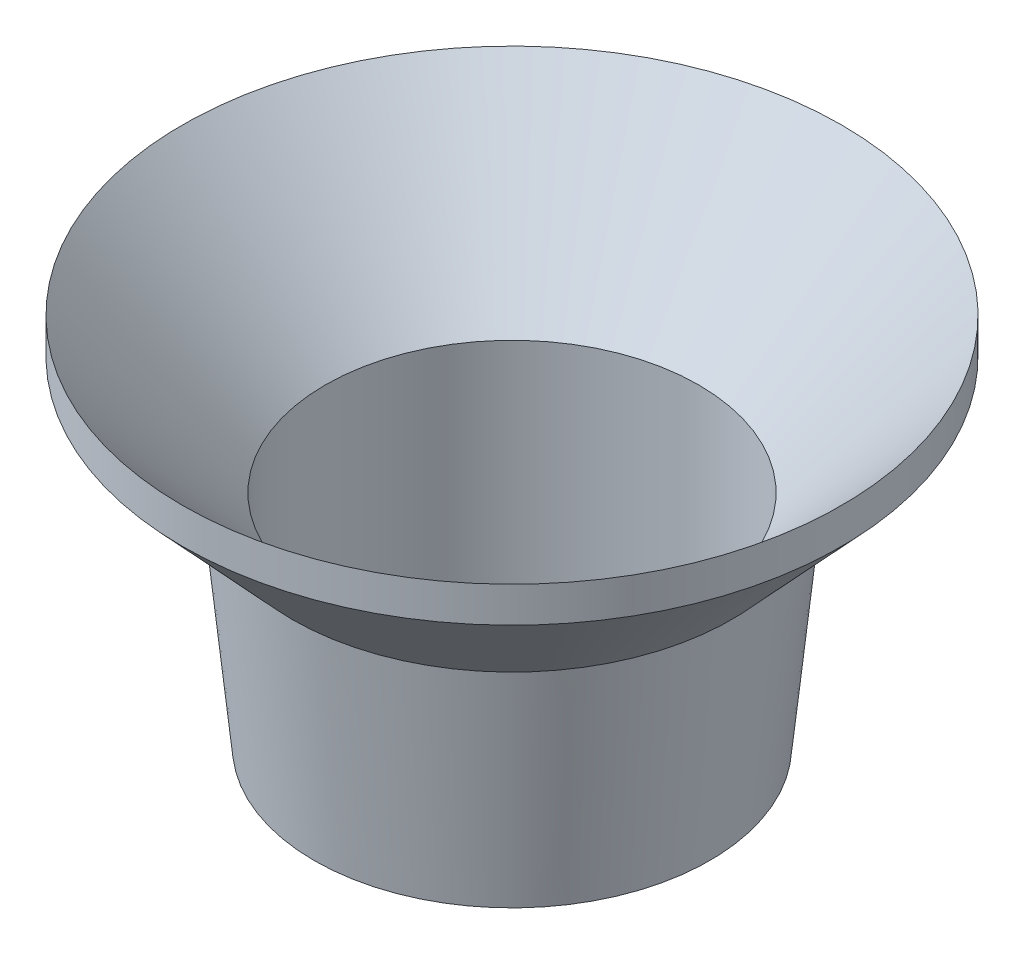
ISO-10303-21;
HEADER;
FILE_DESCRIPTION(('STEP AP214'),'2;1');
FILE_NAME('part.step','',(''),(''),'','','');
FILE_SCHEMA(('AUTOMOTIVE_DESIGN { 1 0 10303 214 1 1 1 1 }'));
ENDSEC;
DATA;
#1=APPLICATION_CONTEXT('core data for automotive mechanical design processes');
#2=APPLICATION_PROTOCOL_DEFINITION('international standard','automotive_design',2000,#1);
#3=PRODUCT_CONTEXT('',#1,'mechanical');
#4=PRODUCT('Part','Part','',(#3));
#5=PRODUCT_RELATED_PRODUCT_CATEGORY('part','',(#4));
#6=PRODUCT_DEFINITION_FORMATION('','',#4);
#7=PRODUCT_DEFINITION_CONTEXT('part definition',#1,'design');
#8=PRODUCT_DEFINITION('design','',#6,#7);
#9=PRODUCT_DEFINITION_SHAPE('','',#8);
#10=(LENGTH_UNIT() NAMED_UNIT(*) SI_UNIT(.MILLI.,.METRE.));
#11=(NAMED_UNIT(*) PLANE_ANGLE_UNIT() SI_UNIT($,.RADIAN.));
#12=(NAMED_UNIT(*) SI_UNIT($,.STERADIAN.) SOLID_ANGLE_UNIT());
#13=UNCERTAINTY_MEASURE_WITH_UNIT(LENGTH_MEASURE(1.E-05),#10,'distance_accuracy_value','');
#14=(GEOMETRIC_REPRESENTATION_CONTEXT(3) GLOBAL_UNCERTAINTY_ASSIGNED_CONTEXT((#13)) GLOBAL_UNIT_ASSIGNED_CONTEXT((#10,
#11,#12)) REPRESENTATION_CONTEXT('',''));
#15=CARTESIAN_POINT('',(0.,0.,0.));
#16=DIRECTION('',(0.,0.,1.));
#17=DIRECTION('',(1.,0.,0.));
#18=AXIS2_PLACEMENT_3D('',#15,#16,#17);
#19=CARTESIAN_POINT('',(0.,20.7758620689655,0.));
#20=DIRECTION('',(0.,1.,0.));
#21=DIRECTION('',(0.,0.,1.));
#22=AXIS2_PLACEMENT_3D('',#19,#20,#21);
#23=CYLINDRICAL_SURFACE('',#22,15.);
#24=CARTESIAN_POINT('',(0.,10.3846153846154,0.));
#25=DIRECTION('',(0.,1.,0.));
#26=DIRECTION('',(0.,0.,1.));
#27=AXIS2_PLACEMENT_3D('',#24,#25,#26);
#28=CIRCLE('',#27,15.);
#29=CARTESIAN_POINT('',(0.,10.3846153846154,15.));
#30=VERTEX_POINT('',#29);
#31=EDGE_CURVE('E53',#30,#30,#28,.T.);
#32=ORIENTED_EDGE('',*,*,#31,.T.);
#33=EDGE_LOOP('',(#32));
#34=FACE_BOUND('',#33,.T.);
#35=CARTESIAN_POINT('',(0.,12.,0.));
#36=DIRECTION('',(0.,1.,0.));
#37=DIRECTION('',(0.,0.,1.));
#38=AXIS2_PLACEMENT_3D('',#35,#36,#37);
#39=CIRCLE('',#38,15.);
#40=CARTESIAN_POINT('',(0.,12.,15.));
#41=VERTEX_POINT('',#40);
#42=EDGE_CURVE('E10',#41,#41,#39,.T.);
#43=ORIENTED_EDGE('',*,*,#42,.F.);
#44=EDGE_LOOP('',(#43));
#45=FACE_BOUND('',#44,.T.);
#46=ADVANCED_FACE('F31',(#34,#45),#23,.T.);
#47=CARTESIAN_POINT('',(0.,4.99999999999999,0.));
#48=DIRECTION('',(0.,1.,0.));
#49=DIRECTION('',(0.,0.,1.));
#50=AXIS2_PLACEMENT_3D('',#47,#48,#49);
#51=CONICAL_SURFACE('',#50,8.50000000000001,0.748378047523518);
#52=ORIENTED_EDGE('',*,*,#42,.T.);
#53=EDGE_LOOP('',(#52));
#54=FACE_BOUND('',#53,.T.);
#55=CARTESIAN_POINT('',(0.,4.99999999999999,0.));
#56=DIRECTION('',(0.,1.,0.));
#57=DIRECTION('',(0.,0.,1.));
#58=AXIS2_PLACEMENT_3D('',#55,#56,#57);
#59=CIRCLE('',#58,8.50000000000001);
#60=CARTESIAN_POINT('',(0.,4.99999999999999,8.50000000000001));
#61=VERTEX_POINT('',#60);
#62=EDGE_CURVE('E37',#61,#61,#59,.T.);
#63=ORIENTED_EDGE('',*,*,#62,.F.);
#64=EDGE_LOOP('',(#63));
#65=FACE_BOUND('',#64,.T.);
#66=ADVANCED_FACE('F71',(#54,#65),#51,.F.);
#67=CARTESIAN_POINT('',(0.,20.7758620689655,0.));
#68=DIRECTION('',(0.,1.,0.));
#69=DIRECTION('',(0.,0.,1.));
#70=AXIS2_PLACEMENT_3D('',#67,#68,#69);
#71=CYLINDRICAL_SURFACE('',#70,8.50000000000001);
#72=ORIENTED_EDGE('',*,*,#62,.T.);
#73=EDGE_LOOP('',(#72));
#74=FACE_BOUND('',#73,.T.);
#75=CARTESIAN_POINT('',(0.,-4.99999999999999,0.));
#76=DIRECTION('',(0.,1.,0.));
#77=DIRECTION('',(0.,0.,1.));
#78=AXIS2_PLACEMENT_3D('',#75,#76,#77);
#79=CIRCLE('',#78,8.50000000000001);
#80=CARTESIAN_POINT('',(0.,-4.99999999999999,8.50000000000001));
#81=VERTEX_POINT('',#80);
#82=EDGE_CURVE('E41',#81,#81,#79,.T.);
#83=ORIENTED_EDGE('',*,*,#82,.F.);
#84=EDGE_LOOP('',(#83));
#85=FACE_BOUND('',#84,.T.);
#86=ADVANCED_FACE('F75',(#74,#85),#71,.F.);
#87=CARTESIAN_POINT('',(0.,-4.99999999999999,8.50000000000001));
#88=DIRECTION('',(0.,-1.,0.));
#89=DIRECTION('',(0.,0.,-1.));
#90=AXIS2_PLACEMENT_3D('',#87,#88,#89);
#91=PLANE('',#90);
#92=ORIENTED_EDGE('',*,*,#82,.T.);
#93=EDGE_LOOP('',(#92));
#94=FACE_BOUND('',#93,.T.);
#95=CARTESIAN_POINT('',(0.,-4.99999999999999,0.));
#96=DIRECTION('',(0.,1.,0.));
#97=DIRECTION('',(0.,0.,1.));
#98=AXIS2_PLACEMENT_3D('',#95,#96,#97);
#99=CIRCLE('',#98,9.00186730528526);
#100=CARTESIAN_POINT('',(0.,-4.99999999999999,9.00186730528526));
#101=VERTEX_POINT('',#100);
#102=EDGE_CURVE('E45',#101,#101,#99,.T.);
#103=ORIENTED_EDGE('',*,*,#102,.F.);
#104=EDGE_LOOP('',(#103));
#105=FACE_BOUND('',#104,.T.);
#106=ADVANCED_FACE('F67',(#94,#105),#91,.T.);
#107=CARTESIAN_POINT('',(0.,5.,0.));
#108=DIRECTION('',(0.,1.,0.));
#109=DIRECTION('',(0.,0.,1.));
#110=AXIS2_PLACEMENT_3D('',#107,#108,#109);
#111=CONICAL_SURFACE('',#110,10.,0.0994837673636697);
#112=ORIENTED_EDGE('',*,*,#102,.T.);
#113=EDGE_LOOP('',(#112));
#114=FACE_BOUND('',#113,.T.);
#115=CARTESIAN_POINT('',(0.,5.,0.));
#116=DIRECTION('',(0.,1.,0.));
#117=DIRECTION('',(0.,0.,1.));
#118=AXIS2_PLACEMENT_3D('',#115,#116,#117);
#119=CIRCLE('',#118,10.);
#120=CARTESIAN_POINT('',(0.,5.,10.));
#121=VERTEX_POINT('',#120);
#122=EDGE_CURVE('E50',#121,#121,#119,.T.);
#123=ORIENTED_EDGE('',*,*,#122,.F.);
#124=EDGE_LOOP('',(#123));
#125=FACE_BOUND('',#124,.T.);
#126=ADVANCED_FACE('F61',(#114,#125),#111,.T.);
#127=CARTESIAN_POINT('',(0.,10.3846153846154,0.));
#128=DIRECTION('',(0.,1.,0.));
#129=DIRECTION('',(0.,0.,1.));
#130=AXIS2_PLACEMENT_3D('',#127,#128,#129);
#131=CONICAL_SURFACE('',#130,15.,0.748378047523518);
#132=ORIENTED_EDGE('',*,*,#122,.T.);
#133=EDGE_LOOP('',(#132));
#134=FACE_BOUND('',#133,.T.);
#135=ORIENTED_EDGE('',*,*,#31,.F.);
#136=EDGE_LOOP('',(#135));
#137=FACE_BOUND('',#136,.T.);
#138=ADVANCED_FACE('F59',(#134,#137),#131,.T.);
#139=CLOSED_SHELL('',(#46,#66,#86,#106,#126,#138));
#140=MANIFOLD_SOLID_BREP('B2',#139);
#141=ADVANCED_BREP_SHAPE_REPRESENTATION('',(#18,#140),#14);
#142=SHAPE_DEFINITION_REPRESENTATION(#9,#141);
ENDSEC;
END-ISO-10303-21;
